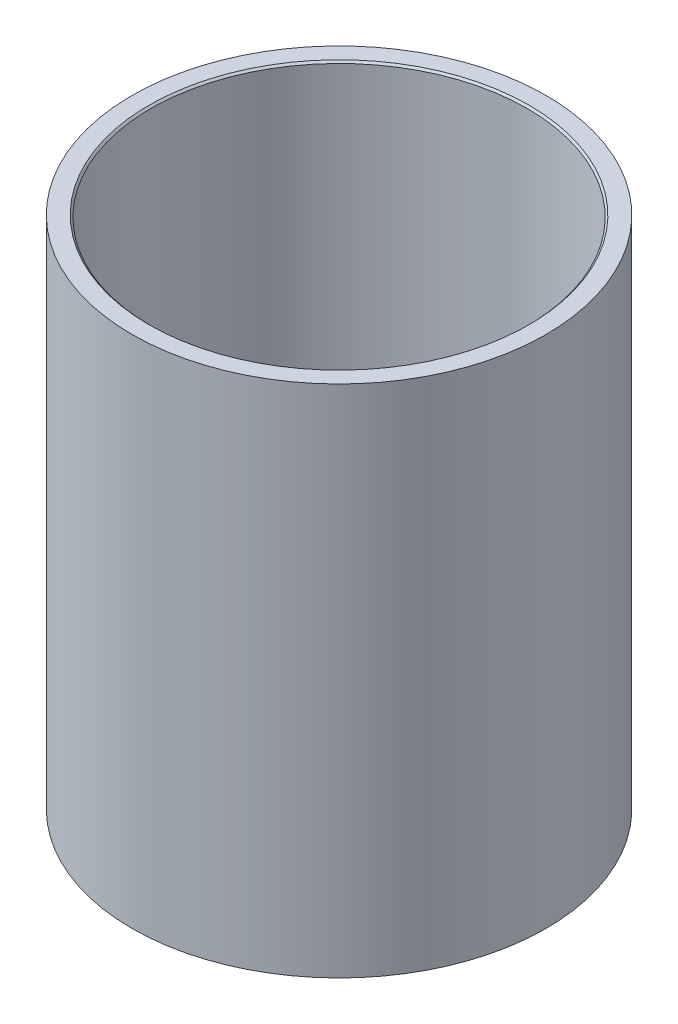
ISO-10303-21;
HEADER;
FILE_DESCRIPTION(('STEP AP214'),'2;1');
FILE_NAME('part.step','',(''),(''),'','','');
FILE_SCHEMA(('AUTOMOTIVE_DESIGN { 1 0 10303 214 1 1 1 1 }'));
ENDSEC;
DATA;
#1=APPLICATION_CONTEXT('core data for automotive mechanical design processes');
#2=APPLICATION_PROTOCOL_DEFINITION('international standard','automotive_design',2000,#1);
#3=PRODUCT_CONTEXT('',#1,'mechanical');
#4=PRODUCT('Part','Part','',(#3));
#5=PRODUCT_RELATED_PRODUCT_CATEGORY('part','',(#4));
#6=PRODUCT_DEFINITION_FORMATION('','',#4);
#7=PRODUCT_DEFINITION_CONTEXT('part definition',#1,'design');
#8=PRODUCT_DEFINITION('design','',#6,#7);
#9=PRODUCT_DEFINITION_SHAPE('','',#8);
#10=(LENGTH_UNIT() NAMED_UNIT(*) SI_UNIT(.MILLI.,.METRE.));
#11=(NAMED_UNIT(*) PLANE_ANGLE_UNIT() SI_UNIT($,.RADIAN.));
#12=(NAMED_UNIT(*) SI_UNIT($,.STERADIAN.) SOLID_ANGLE_UNIT());
#13=UNCERTAINTY_MEASURE_WITH_UNIT(LENGTH_MEASURE(1.E-05),#10,'distance_accuracy_value','');
#14=(GEOMETRIC_REPRESENTATION_CONTEXT(3) GLOBAL_UNCERTAINTY_ASSIGNED_CONTEXT((#13)) GLOBAL_UNIT_ASSIGNED_CONTEXT((#10,
#11,#12)) REPRESENTATION_CONTEXT('',''));
#15=CARTESIAN_POINT('',(0.,0.,0.));
#16=DIRECTION('',(0.,0.,1.));
#17=DIRECTION('',(1.,0.,0.));
#18=AXIS2_PLACEMENT_3D('',#15,#16,#17);
#19=CARTESIAN_POINT('',(0.,82.,0.));
#20=DIRECTION('',(0.,1.,0.));
#21=DIRECTION('',(0.,0.,1.));
#22=AXIS2_PLACEMENT_3D('',#19,#20,#21);
#23=PLANE('',#22);
#24=CARTESIAN_POINT('',(0.,82.,0.));
#25=DIRECTION('',(0.,1.,0.));
#26=DIRECTION('',(0.,0.,1.));
#27=AXIS2_PLACEMENT_3D('',#24,#25,#26);
#28=CIRCLE('',#27,30.3);
#29=CARTESIAN_POINT('',(0.,82.,30.3));
#30=VERTEX_POINT('',#29);
#31=EDGE_CURVE('E10',#30,#30,#28,.F.);
#32=ORIENTED_EDGE('',*,*,#31,.T.);
#33=EDGE_LOOP('',(#32));
#34=FACE_BOUND('',#33,.T.);
#35=CARTESIAN_POINT('',(0.,82.,0.));
#36=DIRECTION('',(0.,1.,0.));
#37=DIRECTION('',(0.,0.,1.));
#38=AXIS2_PLACEMENT_3D('',#35,#36,#37);
#39=CIRCLE('',#38,33.);
#40=CARTESIAN_POINT('',(0.,82.,33.));
#41=VERTEX_POINT('',#40);
#42=EDGE_CURVE('E52',#41,#41,#39,.T.);
#43=ORIENTED_EDGE('',*,*,#42,.T.);
#44=EDGE_LOOP('',(#43));
#45=FACE_BOUND('',#44,.T.);
#46=ADVANCED_FACE('F32',(#34,#45),#23,.T.);
#47=CARTESIAN_POINT('',(0.,0.,0.));
#48=DIRECTION('',(0.,1.,0.));
#49=DIRECTION('',(0.,0.,1.));
#50=AXIS2_PLACEMENT_3D('',#47,#48,#49);
#51=PLANE('',#50);
#52=CARTESIAN_POINT('',(0.,0.,0.));
#53=DIRECTION('',(0.,1.,0.));
#54=DIRECTION('',(0.,0.,1.));
#55=AXIS2_PLACEMENT_3D('',#52,#53,#54);
#56=CIRCLE('',#55,30.3);
#57=CARTESIAN_POINT('',(0.,0.,30.3));
#58=VERTEX_POINT('',#57);
#59=EDGE_CURVE('E47',#58,#58,#56,.T.);
#60=ORIENTED_EDGE('',*,*,#59,.T.);
#61=EDGE_LOOP('',(#60));
#62=FACE_BOUND('',#61,.T.);
#63=CARTESIAN_POINT('',(0.,0.,0.));
#64=DIRECTION('',(0.,1.,0.));
#65=DIRECTION('',(0.,0.,1.));
#66=AXIS2_PLACEMENT_3D('',#63,#64,#65);
#67=CIRCLE('',#66,33.);
#68=CARTESIAN_POINT('',(0.,0.,33.));
#69=VERTEX_POINT('',#68);
#70=EDGE_CURVE('E53',#69,#69,#67,.T.);
#71=ORIENTED_EDGE('',*,*,#70,.F.);
#72=EDGE_LOOP('',(#71));
#73=FACE_BOUND('',#72,.T.);
#74=ADVANCED_FACE('F64',(#62,#73),#51,.F.);
#75=CARTESIAN_POINT('',(0.,82.,0.));
#76=DIRECTION('',(0.,-1.,0.));
#77=DIRECTION('',(0.,0.,-1.));
#78=AXIS2_PLACEMENT_3D('',#75,#76,#77);
#79=CYLINDRICAL_SURFACE('',#78,33.);
#80=ORIENTED_EDGE('',*,*,#42,.F.);
#81=EDGE_LOOP('',(#80));
#82=FACE_BOUND('',#81,.T.);
#83=ORIENTED_EDGE('',*,*,#70,.T.);
#84=EDGE_LOOP('',(#83));
#85=FACE_BOUND('',#84,.T.);
#86=ADVANCED_FACE('F60',(#82,#85),#79,.T.);
#87=CARTESIAN_POINT('',(0.,82.,0.));
#88=DIRECTION('',(0.,-1.,0.));
#89=DIRECTION('',(0.,0.,-1.));
#90=AXIS2_PLACEMENT_3D('',#87,#88,#89);
#91=CYLINDRICAL_SURFACE('',#90,30.);
#92=CARTESIAN_POINT('',(0.,0.299999999999995,0.));
#93=DIRECTION('',(0.,1.,0.));
#94=DIRECTION('',(0.,0.,1.));
#95=AXIS2_PLACEMENT_3D('',#92,#93,#94);
#96=CIRCLE('',#95,30.);
#97=CARTESIAN_POINT('',(0.,0.299999999999995,30.));
#98=VERTEX_POINT('',#97);
#99=EDGE_CURVE('E39',#98,#98,#96,.F.);
#100=ORIENTED_EDGE('',*,*,#99,.T.);
#101=EDGE_LOOP('',(#100));
#102=FACE_BOUND('',#101,.T.);
#103=CARTESIAN_POINT('',(0.,81.7,0.));
#104=DIRECTION('',(0.,1.,0.));
#105=DIRECTION('',(0.,0.,1.));
#106=AXIS2_PLACEMENT_3D('',#103,#104,#105);
#107=CIRCLE('',#106,30.);
#108=CARTESIAN_POINT('',(0.,81.7,30.));
#109=VERTEX_POINT('',#108);
#110=EDGE_CURVE('E43',#109,#109,#107,.T.);
#111=ORIENTED_EDGE('',*,*,#110,.T.);
#112=EDGE_LOOP('',(#111));
#113=FACE_BOUND('',#112,.T.);
#114=ADVANCED_FACE('F63',(#102,#113),#91,.F.);
#115=CARTESIAN_POINT('',(0.,0.,0.));
#116=DIRECTION('',(0.,-1.,0.));
#117=DIRECTION('',(0.,0.,-1.));
#118=AXIS2_PLACEMENT_3D('',#115,#116,#117);
#119=CONICAL_SURFACE('',#118,30.3,0.785398163397443);
#120=ORIENTED_EDGE('',*,*,#99,.F.);
#121=EDGE_LOOP('',(#120));
#122=FACE_BOUND('',#121,.T.);
#123=ORIENTED_EDGE('',*,*,#59,.F.);
#124=EDGE_LOOP('',(#123));
#125=FACE_BOUND('',#124,.T.);
#126=ADVANCED_FACE('F76',(#122,#125),#119,.F.);
#127=CARTESIAN_POINT('',(0.,81.7,0.));
#128=DIRECTION('',(0.,1.,0.));
#129=DIRECTION('',(0.,0.,1.));
#130=AXIS2_PLACEMENT_3D('',#127,#128,#129);
#131=CONICAL_SURFACE('',#130,30.,0.785398163397443);
#132=ORIENTED_EDGE('',*,*,#31,.F.);
#133=EDGE_LOOP('',(#132));
#134=FACE_BOUND('',#133,.T.);
#135=ORIENTED_EDGE('',*,*,#110,.F.);
#136=EDGE_LOOP('',(#135));
#137=FACE_BOUND('',#136,.T.);
#138=ADVANCED_FACE('F34',(#134,#137),#131,.F.);
#139=CLOSED_SHELL('',(#46,#74,#86,#114,#126,#138));
#140=MANIFOLD_SOLID_BREP('B2',#139);
#141=ADVANCED_BREP_SHAPE_REPRESENTATION('',(#18,#140),#14);
#142=SHAPE_DEFINITION_REPRESENTATION(#9,#141);
ENDSEC;
END-ISO-10303-21;
